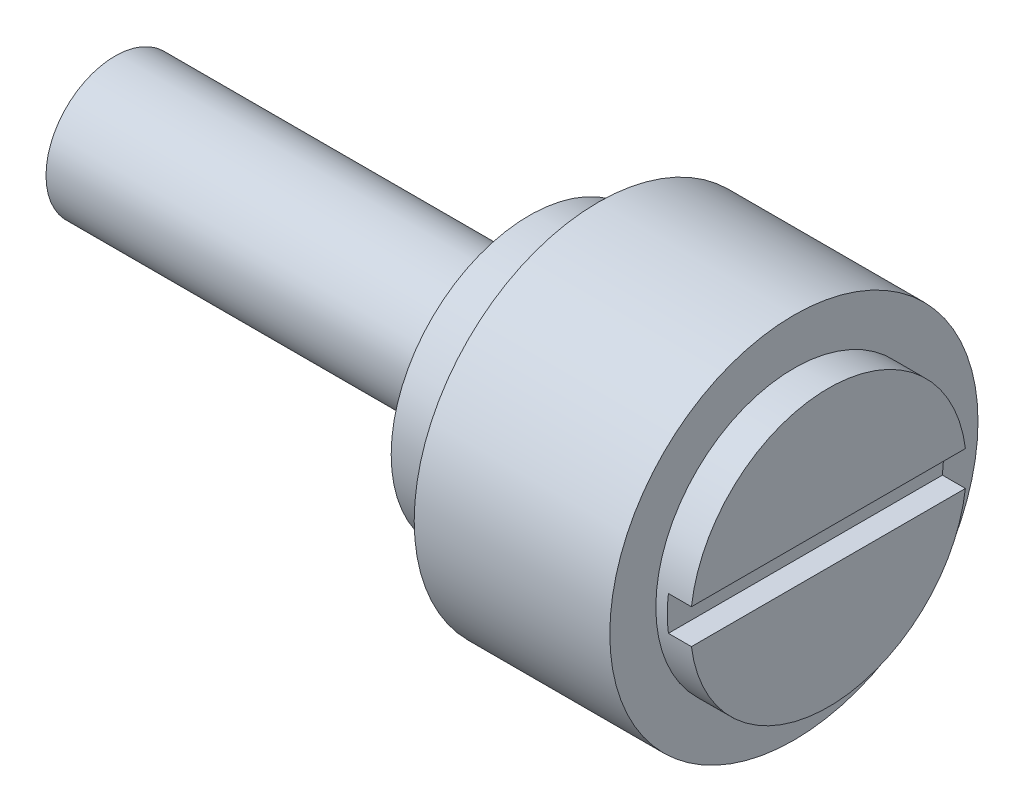
ISO-10303-21;
HEADER;
FILE_DESCRIPTION(('STEP AP214'),'2;1');
FILE_NAME('part.step','',(''),(''),'','','');
FILE_SCHEMA(('AUTOMOTIVE_DESIGN { 1 0 10303 214 1 1 1 1 }'));
ENDSEC;
DATA;
#1=APPLICATION_CONTEXT('core data for automotive mechanical design processes');
#2=APPLICATION_PROTOCOL_DEFINITION('international standard','automotive_design',2000,#1);
#3=PRODUCT_CONTEXT('',#1,'mechanical');
#4=PRODUCT('Part','Part','',(#3));
#5=PRODUCT_RELATED_PRODUCT_CATEGORY('part','',(#4));
#6=PRODUCT_DEFINITION_FORMATION('','',#4);
#7=PRODUCT_DEFINITION_CONTEXT('part definition',#1,'design');
#8=PRODUCT_DEFINITION('design','',#6,#7);
#9=PRODUCT_DEFINITION_SHAPE('','',#8);
#10=(LENGTH_UNIT() NAMED_UNIT(*) SI_UNIT(.MILLI.,.METRE.));
#11=(NAMED_UNIT(*) PLANE_ANGLE_UNIT() SI_UNIT($,.RADIAN.));
#12=(NAMED_UNIT(*) SI_UNIT($,.STERADIAN.) SOLID_ANGLE_UNIT());
#13=UNCERTAINTY_MEASURE_WITH_UNIT(LENGTH_MEASURE(1.E-05),#10,'distance_accuracy_value','');
#14=(GEOMETRIC_REPRESENTATION_CONTEXT(3) GLOBAL_UNCERTAINTY_ASSIGNED_CONTEXT((#13)) GLOBAL_UNIT_ASSIGNED_CONTEXT((#10,
#11,#12)) REPRESENTATION_CONTEXT('',''));
#15=CARTESIAN_POINT('',(0.,0.,0.));
#16=DIRECTION('',(0.,0.,1.));
#17=DIRECTION('',(1.,0.,0.));
#18=AXIS2_PLACEMENT_3D('',#15,#16,#17);
#19=CARTESIAN_POINT('',(31.,6.,0.));
#20=DIRECTION('',(-1.,0.,0.));
#21=DIRECTION('',(0.,0.,1.));
#22=AXIS2_PLACEMENT_3D('',#19,#20,#21);
#23=PLANE('',#22);
#24=CARTESIAN_POINT('',(31.,0.,0.));
#25=DIRECTION('',(-1.,0.,0.));
#26=DIRECTION('',(0.,0.,1.));
#27=AXIS2_PLACEMENT_3D('',#24,#25,#26);
#28=CIRCLE('',#27,6.);
#29=CARTESIAN_POINT('',(31.,0.75,5.95294044989533));
#30=VERTEX_POINT('',#29);
#31=CARTESIAN_POINT('',(31.,0.75,-5.95294044989533));
#32=VERTEX_POINT('',#31);
#33=EDGE_CURVE('E93',#30,#32,#28,.T.);
#34=ORIENTED_EDGE('',*,*,#33,.F.);
#35=DIRECTION('',(0.,0.,-1.));
#36=VECTOR('',#35,1.);
#37=CARTESIAN_POINT('',(31.,0.75,0.));
#38=LINE('',#37,#36);
#39=EDGE_CURVE('E81',#30,#32,#38,.T.);
#40=ORIENTED_EDGE('',*,*,#39,.T.);
#41=EDGE_LOOP('',(#34,#40));
#42=FACE_BOUND('',#41,.T.);
#43=ADVANCED_FACE('F33',(#42),#23,.F.);
#44=CARTESIAN_POINT('',(0.,0.,0.));
#45=DIRECTION('',(1.,0.,0.));
#46=DIRECTION('',(0.,0.,-1.));
#47=AXIS2_PLACEMENT_3D('',#44,#45,#46);
#48=PLANE('',#47);
#49=CARTESIAN_POINT('',(0.,0.,0.));
#50=DIRECTION('',(-1.,0.,0.));
#51=DIRECTION('',(0.,0.,1.));
#52=AXIS2_PLACEMENT_3D('',#49,#50,#51);
#53=CIRCLE('',#52,3.);
#54=CARTESIAN_POINT('',(0.,0.,3.));
#55=VERTEX_POINT('',#54);
#56=EDGE_CURVE('E82',#55,#55,#53,.T.);
#57=ORIENTED_EDGE('',*,*,#56,.T.);
#58=EDGE_LOOP('',(#57));
#59=FACE_BOUND('',#58,.T.);
#60=ADVANCED_FACE('F35',(#59),#48,.F.);
#61=CARTESIAN_POINT('',(0.,0.,0.));
#62=DIRECTION('',(-1.,0.,0.));
#63=DIRECTION('',(0.,0.,1.));
#64=AXIS2_PLACEMENT_3D('',#61,#62,#63);
#65=CYLINDRICAL_SURFACE('',#64,3.);
#66=ORIENTED_EDGE('',*,*,#56,.F.);
#67=EDGE_LOOP('',(#66));
#68=FACE_BOUND('',#67,.T.);
#69=CARTESIAN_POINT('',(18.,0.,0.));
#70=DIRECTION('',(-1.,0.,0.));
#71=DIRECTION('',(0.,0.,1.));
#72=AXIS2_PLACEMENT_3D('',#69,#70,#71);
#73=CIRCLE('',#72,3.);
#74=CARTESIAN_POINT('',(18.,0.,3.));
#75=VERTEX_POINT('',#74);
#76=EDGE_CURVE('E114',#75,#75,#73,.T.);
#77=ORIENTED_EDGE('',*,*,#76,.T.);
#78=EDGE_LOOP('',(#77));
#79=FACE_BOUND('',#78,.T.);
#80=ADVANCED_FACE('F134',(#68,#79),#65,.T.);
#81=CARTESIAN_POINT('',(18.,3.,0.));
#82=DIRECTION('',(1.,0.,0.));
#83=DIRECTION('',(0.,0.,-1.));
#84=AXIS2_PLACEMENT_3D('',#81,#82,#83);
#85=PLANE('',#84);
#86=ORIENTED_EDGE('',*,*,#76,.F.);
#87=EDGE_LOOP('',(#86));
#88=FACE_BOUND('',#87,.T.);
#89=CARTESIAN_POINT('',(18.,0.,0.));
#90=DIRECTION('',(-1.,0.,0.));
#91=DIRECTION('',(0.,0.,1.));
#92=AXIS2_PLACEMENT_3D('',#89,#90,#91);
#93=CIRCLE('',#92,6.);
#94=CARTESIAN_POINT('',(18.,0.,6.));
#95=VERTEX_POINT('',#94);
#96=EDGE_CURVE('E111',#95,#95,#93,.T.);
#97=ORIENTED_EDGE('',*,*,#96,.T.);
#98=EDGE_LOOP('',(#97));
#99=FACE_BOUND('',#98,.T.);
#100=ADVANCED_FACE('F162',(#88,#99),#85,.F.);
#101=CARTESIAN_POINT('',(0.,0.,0.));
#102=DIRECTION('',(-1.,0.,0.));
#103=DIRECTION('',(0.,0.,1.));
#104=AXIS2_PLACEMENT_3D('',#101,#102,#103);
#105=CYLINDRICAL_SURFACE('',#104,6.);
#106=ORIENTED_EDGE('',*,*,#96,.F.);
#107=EDGE_LOOP('',(#106));
#108=FACE_BOUND('',#107,.T.);
#109=CARTESIAN_POINT('',(21.,0.,0.));
#110=DIRECTION('',(-1.,0.,0.));
#111=DIRECTION('',(0.,0.,1.));
#112=AXIS2_PLACEMENT_3D('',#109,#110,#111);
#113=CIRCLE('',#112,6.);
#114=CARTESIAN_POINT('',(21.,0.,6.));
#115=VERTEX_POINT('',#114);
#116=EDGE_CURVE('E108',#115,#115,#113,.T.);
#117=ORIENTED_EDGE('',*,*,#116,.T.);
#118=EDGE_LOOP('',(#117));
#119=FACE_BOUND('',#118,.T.);
#120=ADVANCED_FACE('F158',(#108,#119),#105,.T.);
#121=CARTESIAN_POINT('',(21.,6.,0.));
#122=DIRECTION('',(1.,0.,0.));
#123=DIRECTION('',(0.,0.,-1.));
#124=AXIS2_PLACEMENT_3D('',#121,#122,#123);
#125=PLANE('',#124);
#126=ORIENTED_EDGE('',*,*,#116,.F.);
#127=EDGE_LOOP('',(#126));
#128=FACE_BOUND('',#127,.T.);
#129=CARTESIAN_POINT('',(21.,0.,0.));
#130=DIRECTION('',(-1.,0.,0.));
#131=DIRECTION('',(0.,0.,1.));
#132=AXIS2_PLACEMENT_3D('',#129,#130,#131);
#133=CIRCLE('',#132,8.);
#134=CARTESIAN_POINT('',(21.,0.,8.));
#135=VERTEX_POINT('',#134);
#136=EDGE_CURVE('E105',#135,#135,#133,.T.);
#137=ORIENTED_EDGE('',*,*,#136,.T.);
#138=EDGE_LOOP('',(#137));
#139=FACE_BOUND('',#138,.T.);
#140=ADVANCED_FACE('F154',(#128,#139),#125,.F.);
#141=CARTESIAN_POINT('',(0.,0.,0.));
#142=DIRECTION('',(-1.,0.,0.));
#143=DIRECTION('',(0.,0.,1.));
#144=AXIS2_PLACEMENT_3D('',#141,#142,#143);
#145=CYLINDRICAL_SURFACE('',#144,8.);
#146=ORIENTED_EDGE('',*,*,#136,.F.);
#147=EDGE_LOOP('',(#146));
#148=FACE_BOUND('',#147,.T.);
#149=CARTESIAN_POINT('',(29.5,0.,0.));
#150=DIRECTION('',(-1.,0.,0.));
#151=DIRECTION('',(0.,0.,1.));
#152=AXIS2_PLACEMENT_3D('',#149,#150,#151);
#153=CIRCLE('',#152,8.);
#154=CARTESIAN_POINT('',(29.5,0.,8.));
#155=VERTEX_POINT('',#154);
#156=EDGE_CURVE('E102',#155,#155,#153,.T.);
#157=ORIENTED_EDGE('',*,*,#156,.T.);
#158=EDGE_LOOP('',(#157));
#159=FACE_BOUND('',#158,.T.);
#160=ADVANCED_FACE('F148',(#148,#159),#145,.T.);
#161=CARTESIAN_POINT('',(29.5,8.,0.));
#162=DIRECTION('',(-1.,0.,0.));
#163=DIRECTION('',(0.,0.,1.));
#164=AXIS2_PLACEMENT_3D('',#161,#162,#163);
#165=PLANE('',#164);
#166=ORIENTED_EDGE('',*,*,#156,.F.);
#167=EDGE_LOOP('',(#166));
#168=FACE_BOUND('',#167,.T.);
#169=CARTESIAN_POINT('',(29.5,0.,0.));
#170=DIRECTION('',(-1.,0.,0.));
#171=DIRECTION('',(0.,0.,1.));
#172=AXIS2_PLACEMENT_3D('',#169,#170,#171);
#173=CIRCLE('',#172,6.);
#174=CARTESIAN_POINT('',(29.5,0.,6.));
#175=VERTEX_POINT('',#174);
#176=EDGE_CURVE('E96',#175,#175,#173,.T.);
#177=ORIENTED_EDGE('',*,*,#176,.T.);
#178=EDGE_LOOP('',(#177));
#179=FACE_BOUND('',#178,.T.);
#180=ADVANCED_FACE('F144',(#168,#179),#165,.F.);
#181=CARTESIAN_POINT('',(0.,0.,0.));
#182=DIRECTION('',(-1.,0.,0.));
#183=DIRECTION('',(0.,0.,1.));
#184=AXIS2_PLACEMENT_3D('',#181,#182,#183);
#185=CYLINDRICAL_SURFACE('',#184,6.);
#186=ORIENTED_EDGE('',*,*,#33,.T.);
#187=DIRECTION('',(-1.,0.,0.));
#188=VECTOR('',#187,1.);
#189=CARTESIAN_POINT('',(0.,0.75,-5.95294044989533));
#190=LINE('',#189,#188);
#191=CARTESIAN_POINT('',(30.,0.75,-5.95294044989533));
#192=VERTEX_POINT('',#191);
#193=EDGE_CURVE('E94',#32,#192,#190,.T.);
#194=ORIENTED_EDGE('',*,*,#193,.T.);
#195=CARTESIAN_POINT('',(30.,0.,0.));
#196=DIRECTION('',(-1.,0.,0.));
#197=DIRECTION('',(0.,0.,1.));
#198=AXIS2_PLACEMENT_3D('',#195,#196,#197);
#199=CIRCLE('',#198,6.);
#200=CARTESIAN_POINT('',(30.,-0.75,-5.95294044989533));
#201=VERTEX_POINT('',#200);
#202=EDGE_CURVE('E11',#192,#201,#199,.T.);
#203=ORIENTED_EDGE('',*,*,#202,.T.);
#204=DIRECTION('',(-1.,0.,0.));
#205=VECTOR('',#204,1.);
#206=CARTESIAN_POINT('',(0.,-0.75,-5.95294044989533));
#207=LINE('',#206,#205);
#208=CARTESIAN_POINT('',(31.,-0.75,-5.95294044989533));
#209=VERTEX_POINT('',#208);
#210=EDGE_CURVE('E76',#201,#209,#207,.F.);
#211=ORIENTED_EDGE('',*,*,#210,.T.);
#212=CARTESIAN_POINT('',(31.,-0.75,5.95294044989533));
#213=VERTEX_POINT('',#212);
#214=EDGE_CURVE('E88',#209,#213,#28,.T.);
#215=ORIENTED_EDGE('',*,*,#214,.T.);
#216=DIRECTION('',(-1.,0.,0.));
#217=VECTOR('',#216,1.);
#218=CARTESIAN_POINT('',(0.,-0.75,5.95294044989533));
#219=LINE('',#218,#217);
#220=CARTESIAN_POINT('',(30.,-0.75,5.95294044989533));
#221=VERTEX_POINT('',#220);
#222=EDGE_CURVE('E48',#213,#221,#219,.T.);
#223=ORIENTED_EDGE('',*,*,#222,.T.);
#224=CARTESIAN_POINT('',(30.,0.75,5.95294044989533));
#225=VERTEX_POINT('',#224);
#226=EDGE_CURVE('E37',#221,#225,#199,.T.);
#227=ORIENTED_EDGE('',*,*,#226,.T.);
#228=DIRECTION('',(-1.,0.,0.));
#229=VECTOR('',#228,1.);
#230=CARTESIAN_POINT('',(0.,0.75,5.95294044989533));
#231=LINE('',#230,#229);
#232=EDGE_CURVE('E56',#225,#30,#231,.F.);
#233=ORIENTED_EDGE('',*,*,#232,.T.);
#234=EDGE_LOOP('',(#186,#194,#203,#211,#215,#223,#227,#233));
#235=FACE_BOUND('',#234,.T.);
#236=ORIENTED_EDGE('',*,*,#176,.F.);
#237=EDGE_LOOP('',(#236));
#238=FACE_BOUND('',#237,.T.);
#239=ADVANCED_FACE('F86',(#235,#238),#185,.T.);
#240=ORIENTED_EDGE('',*,*,#214,.F.);
#241=DIRECTION('',(0.,0.,1.));
#242=VECTOR('',#241,1.);
#243=CARTESIAN_POINT('',(31.,-0.75,0.));
#244=LINE('',#243,#242);
#245=EDGE_CURVE('E73',#209,#213,#244,.T.);
#246=ORIENTED_EDGE('',*,*,#245,.T.);
#247=EDGE_LOOP('',(#240,#246));
#248=FACE_BOUND('',#247,.T.);
#249=ADVANCED_FACE('F92',(#248),#23,.F.);
#250=CARTESIAN_POINT('',(30.,0.,0.));
#251=DIRECTION('',(-1.,0.,0.));
#252=DIRECTION('',(0.,0.,1.));
#253=AXIS2_PLACEMENT_3D('',#250,#251,#252);
#254=PLANE('',#253);
#255=DIRECTION('',(0.,0.,1.));
#256=VECTOR('',#255,1.);
#257=CARTESIAN_POINT('',(30.,0.75,8.));
#258=LINE('',#257,#256);
#259=EDGE_CURVE('E90',#192,#225,#258,.T.);
#260=ORIENTED_EDGE('',*,*,#259,.T.);
#261=ORIENTED_EDGE('',*,*,#226,.F.);
#262=DIRECTION('',(0.,0.,-1.));
#263=VECTOR('',#262,1.);
#264=CARTESIAN_POINT('',(30.,-0.75,-8.));
#265=LINE('',#264,#263);
#266=EDGE_CURVE('E124',#221,#201,#265,.T.);
#267=ORIENTED_EDGE('',*,*,#266,.T.);
#268=ORIENTED_EDGE('',*,*,#202,.F.);
#269=EDGE_LOOP('',(#260,#261,#267,#268));
#270=FACE_BOUND('',#269,.T.);
#271=ADVANCED_FACE('F123',(#270),#254,.F.);
#272=CARTESIAN_POINT('',(30.,0.75,8.));
#273=DIRECTION('',(0.,1.,0.));
#274=DIRECTION('',(0.,0.,1.));
#275=AXIS2_PLACEMENT_3D('',#272,#273,#274);
#276=PLANE('',#275);
#277=ORIENTED_EDGE('',*,*,#39,.F.);
#278=ORIENTED_EDGE('',*,*,#232,.F.);
#279=ORIENTED_EDGE('',*,*,#259,.F.);
#280=ORIENTED_EDGE('',*,*,#193,.F.);
#281=EDGE_LOOP('',(#277,#278,#279,#280));
#282=FACE_BOUND('',#281,.T.);
#283=ADVANCED_FACE('F128',(#282),#276,.F.);
#284=CARTESIAN_POINT('',(30.,-0.75,-8.));
#285=DIRECTION('',(0.,-1.,0.));
#286=DIRECTION('',(0.,0.,-1.));
#287=AXIS2_PLACEMENT_3D('',#284,#285,#286);
#288=PLANE('',#287);
#289=ORIENTED_EDGE('',*,*,#245,.F.);
#290=ORIENTED_EDGE('',*,*,#210,.F.);
#291=ORIENTED_EDGE('',*,*,#266,.F.);
#292=ORIENTED_EDGE('',*,*,#222,.F.);
#293=EDGE_LOOP('',(#289,#290,#291,#292));
#294=FACE_BOUND('',#293,.T.);
#295=ADVANCED_FACE('F75',(#294),#288,.F.);
#296=CLOSED_SHELL('',(#43,#60,#80,#100,#120,#140,#160,#180,#239,#249,#271,#283,#295));
#297=MANIFOLD_SOLID_BREP('B2',#296);
#298=ADVANCED_BREP_SHAPE_REPRESENTATION('',(#18,#297),#14);
#299=SHAPE_DEFINITION_REPRESENTATION(#9,#298);
ENDSEC;
END-ISO-10303-21;
